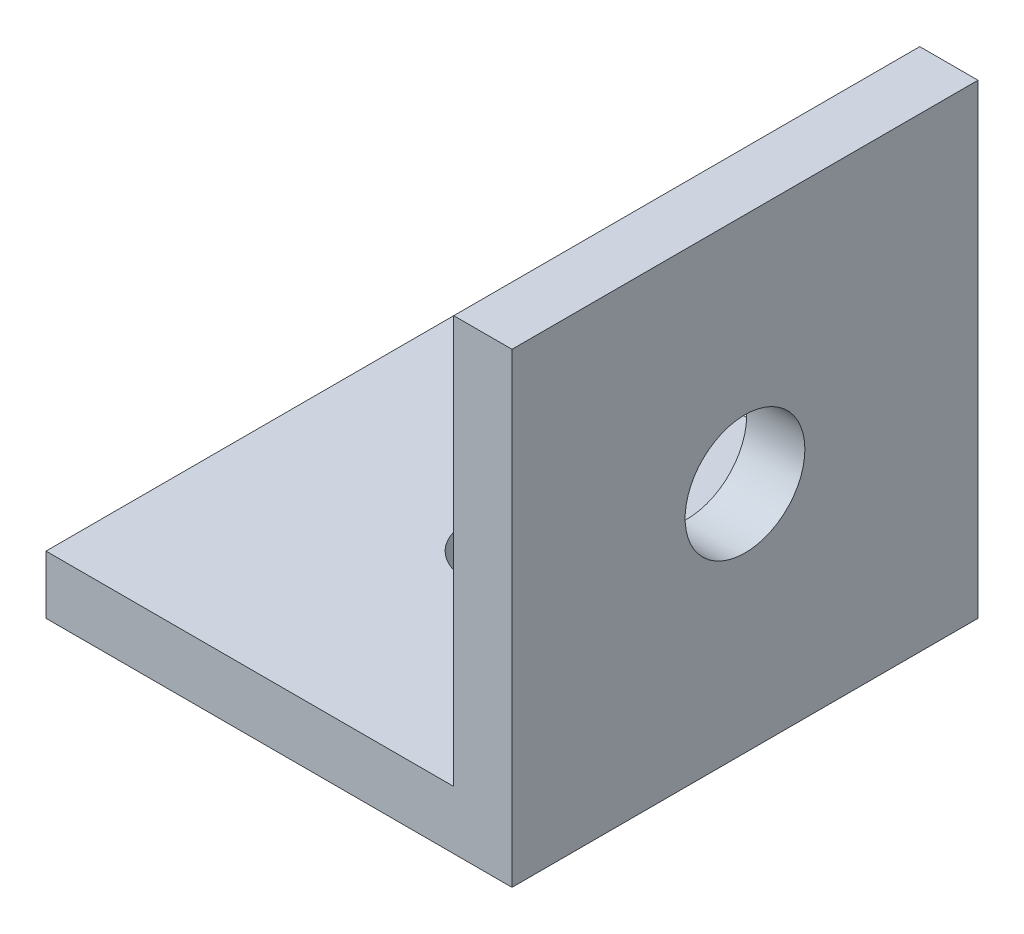
ISO-10303-21;
HEADER;
FILE_DESCRIPTION(('STEP AP214'),'2;1');
FILE_NAME('part.step','',(''),(''),'','','');
FILE_SCHEMA(('AUTOMOTIVE_DESIGN { 1 0 10303 214 1 1 1 1 }'));
ENDSEC;
DATA;
#1=APPLICATION_CONTEXT('core data for automotive mechanical design processes');
#2=APPLICATION_PROTOCOL_DEFINITION('international standard','automotive_design',2000,#1);
#3=PRODUCT_CONTEXT('',#1,'mechanical');
#4=PRODUCT('Part','Part','',(#3));
#5=PRODUCT_RELATED_PRODUCT_CATEGORY('part','',(#4));
#6=PRODUCT_DEFINITION_FORMATION('','',#4);
#7=PRODUCT_DEFINITION_CONTEXT('part definition',#1,'design');
#8=PRODUCT_DEFINITION('design','',#6,#7);
#9=PRODUCT_DEFINITION_SHAPE('','',#8);
#10=(LENGTH_UNIT() NAMED_UNIT(*) SI_UNIT(.MILLI.,.METRE.));
#11=(NAMED_UNIT(*) PLANE_ANGLE_UNIT() SI_UNIT($,.RADIAN.));
#12=(NAMED_UNIT(*) SI_UNIT($,.STERADIAN.) SOLID_ANGLE_UNIT());
#13=UNCERTAINTY_MEASURE_WITH_UNIT(LENGTH_MEASURE(1.E-05),#10,'distance_accuracy_value','');
#14=(GEOMETRIC_REPRESENTATION_CONTEXT(3) GLOBAL_UNCERTAINTY_ASSIGNED_CONTEXT((#13)) GLOBAL_UNIT_ASSIGNED_CONTEXT((#10,
#11,#12)) REPRESENTATION_CONTEXT('',''));
#15=CARTESIAN_POINT('',(0.,0.,0.));
#16=DIRECTION('',(0.,0.,1.));
#17=DIRECTION('',(1.,0.,0.));
#18=AXIS2_PLACEMENT_3D('',#15,#16,#17);
#19=CARTESIAN_POINT('',(0.,3.175,25.4));
#20=DIRECTION('',(1.,0.,0.));
#21=DIRECTION('',(0.,0.,-1.));
#22=AXIS2_PLACEMENT_3D('',#19,#20,#21);
#23=PLANE('',#22);
#24=DIRECTION('',(0.,-1.,0.));
#25=VECTOR('',#24,1.);
#26=CARTESIAN_POINT('',(0.,3.175,0.));
#27=LINE('',#26,#25);
#28=CARTESIAN_POINT('',(0.,3.175,0.));
#29=VERTEX_POINT('',#28);
#30=CARTESIAN_POINT('',(0.,0.,0.));
#31=VERTEX_POINT('',#30);
#32=EDGE_CURVE('E117',#29,#31,#27,.T.);
#33=ORIENTED_EDGE('',*,*,#32,.T.);
#34=DIRECTION('',(0.,0.,-1.));
#35=VECTOR('',#34,1.);
#36=CARTESIAN_POINT('',(0.,0.,25.4));
#37=LINE('',#36,#35);
#38=CARTESIAN_POINT('',(0.,0.,25.4));
#39=VERTEX_POINT('',#38);
#40=EDGE_CURVE('E11',#39,#31,#37,.T.);
#41=ORIENTED_EDGE('',*,*,#40,.F.);
#42=DIRECTION('',(0.,-1.,0.));
#43=VECTOR('',#42,1.);
#44=CARTESIAN_POINT('',(0.,3.175,25.4));
#45=LINE('',#44,#43);
#46=CARTESIAN_POINT('',(0.,3.175,25.4));
#47=VERTEX_POINT('',#46);
#48=EDGE_CURVE('E128',#47,#39,#45,.T.);
#49=ORIENTED_EDGE('',*,*,#48,.F.);
#50=DIRECTION('',(0.,0.,-1.));
#51=VECTOR('',#50,1.);
#52=CARTESIAN_POINT('',(0.,3.175,25.4));
#53=LINE('',#52,#51);
#54=EDGE_CURVE('E113',#47,#29,#53,.T.);
#55=ORIENTED_EDGE('',*,*,#54,.T.);
#56=EDGE_LOOP('',(#33,#41,#49,#55));
#57=FACE_BOUND('',#56,.T.);
#58=ADVANCED_FACE('F33',(#57),#23,.F.);
#59=CARTESIAN_POINT('',(0.,0.,25.4));
#60=DIRECTION('',(0.,1.,0.));
#61=DIRECTION('',(0.,0.,1.));
#62=AXIS2_PLACEMENT_3D('',#59,#60,#61);
#63=PLANE('',#62);
#64=CARTESIAN_POINT('',(12.7,0.,12.7));
#65=DIRECTION('',(0.,-1.,0.));
#66=DIRECTION('',(0.,0.,-1.));
#67=AXIS2_PLACEMENT_3D('',#64,#65,#66);
#68=CIRCLE('',#67,2.57968749999999);
#69=CARTESIAN_POINT('',(12.7,0.,10.1203125));
#70=VERTEX_POINT('',#69);
#71=EDGE_CURVE('E233',#70,#70,#68,.T.);
#72=ORIENTED_EDGE('',*,*,#71,.F.);
#73=EDGE_LOOP('',(#72));
#74=FACE_BOUND('',#73,.T.);
#75=DIRECTION('',(1.,0.,0.));
#76=VECTOR('',#75,1.);
#77=CARTESIAN_POINT('',(0.,0.,0.));
#78=LINE('',#77,#76);
#79=CARTESIAN_POINT('',(25.4,0.,0.));
#80=VERTEX_POINT('',#79);
#81=EDGE_CURVE('E120',#31,#80,#78,.T.);
#82=ORIENTED_EDGE('',*,*,#81,.T.);
#83=DIRECTION('',(0.,0.,-1.));
#84=VECTOR('',#83,1.);
#85=CARTESIAN_POINT('',(25.4,0.,25.4));
#86=LINE('',#85,#84);
#87=CARTESIAN_POINT('',(25.4,0.,25.4));
#88=VERTEX_POINT('',#87);
#89=EDGE_CURVE('E41',#88,#80,#86,.T.);
#90=ORIENTED_EDGE('',*,*,#89,.F.);
#91=DIRECTION('',(1.,0.,0.));
#92=VECTOR('',#91,1.);
#93=CARTESIAN_POINT('',(0.,0.,25.4));
#94=LINE('',#93,#92);
#95=EDGE_CURVE('E86',#39,#88,#94,.T.);
#96=ORIENTED_EDGE('',*,*,#95,.F.);
#97=ORIENTED_EDGE('',*,*,#40,.T.);
#98=EDGE_LOOP('',(#82,#90,#96,#97));
#99=FACE_BOUND('',#98,.T.);
#100=ADVANCED_FACE('F156',(#74,#99),#63,.F.);
#101=CARTESIAN_POINT('',(25.4,0.,25.4));
#102=DIRECTION('',(-1.,0.,0.));
#103=DIRECTION('',(0.,0.,1.));
#104=AXIS2_PLACEMENT_3D('',#101,#102,#103);
#105=PLANE('',#104);
#106=CARTESIAN_POINT('',(25.4,12.7,12.7));
#107=DIRECTION('',(1.,0.,0.));
#108=DIRECTION('',(0.,0.,-1.));
#109=AXIS2_PLACEMENT_3D('',#106,#107,#108);
#110=CIRCLE('',#109,3.2639);
#111=CARTESIAN_POINT('',(25.4,12.7,9.4361));
#112=VERTEX_POINT('',#111);
#113=EDGE_CURVE('E243',#112,#112,#110,.T.);
#114=ORIENTED_EDGE('',*,*,#113,.F.);
#115=EDGE_LOOP('',(#114));
#116=FACE_BOUND('',#115,.T.);
#117=DIRECTION('',(0.,1.,0.));
#118=VECTOR('',#117,1.);
#119=CARTESIAN_POINT('',(25.4,0.,0.));
#120=LINE('',#119,#118);
#121=CARTESIAN_POINT('',(25.4,25.4,0.));
#122=VERTEX_POINT('',#121);
#123=EDGE_CURVE('E123',#80,#122,#120,.T.);
#124=ORIENTED_EDGE('',*,*,#123,.T.);
#125=DIRECTION('',(0.,0.,-1.));
#126=VECTOR('',#125,1.);
#127=CARTESIAN_POINT('',(25.4,25.4,25.4));
#128=LINE('',#127,#126);
#129=CARTESIAN_POINT('',(25.4,25.4,25.4));
#130=VERTEX_POINT('',#129);
#131=EDGE_CURVE('E108',#130,#122,#128,.T.);
#132=ORIENTED_EDGE('',*,*,#131,.F.);
#133=DIRECTION('',(0.,1.,0.));
#134=VECTOR('',#133,1.);
#135=CARTESIAN_POINT('',(25.4,0.,25.4));
#136=LINE('',#135,#134);
#137=EDGE_CURVE('E99',#88,#130,#136,.T.);
#138=ORIENTED_EDGE('',*,*,#137,.F.);
#139=ORIENTED_EDGE('',*,*,#89,.T.);
#140=EDGE_LOOP('',(#124,#132,#138,#139));
#141=FACE_BOUND('',#140,.T.);
#142=ADVANCED_FACE('F134',(#116,#141),#105,.F.);
#143=CARTESIAN_POINT('',(25.4,25.4,25.4));
#144=DIRECTION('',(0.,-1.,0.));
#145=DIRECTION('',(0.,0.,-1.));
#146=AXIS2_PLACEMENT_3D('',#143,#144,#145);
#147=PLANE('',#146);
#148=DIRECTION('',(-1.,0.,0.));
#149=VECTOR('',#148,1.);
#150=CARTESIAN_POINT('',(25.4,25.4,0.));
#151=LINE('',#150,#149);
#152=CARTESIAN_POINT('',(22.225,25.4,0.));
#153=VERTEX_POINT('',#152);
#154=EDGE_CURVE('E107',#122,#153,#151,.T.);
#155=ORIENTED_EDGE('',*,*,#154,.T.);
#156=DIRECTION('',(0.,0.,-1.));
#157=VECTOR('',#156,1.);
#158=CARTESIAN_POINT('',(22.225,25.4,25.4));
#159=LINE('',#158,#157);
#160=CARTESIAN_POINT('',(22.225,25.4,25.4));
#161=VERTEX_POINT('',#160);
#162=EDGE_CURVE('E104',#161,#153,#159,.T.);
#163=ORIENTED_EDGE('',*,*,#162,.F.);
#164=DIRECTION('',(-1.,0.,0.));
#165=VECTOR('',#164,1.);
#166=CARTESIAN_POINT('',(25.4,25.4,25.4));
#167=LINE('',#166,#165);
#168=EDGE_CURVE('E93',#130,#161,#167,.T.);
#169=ORIENTED_EDGE('',*,*,#168,.F.);
#170=ORIENTED_EDGE('',*,*,#131,.T.);
#171=EDGE_LOOP('',(#155,#163,#169,#170));
#172=FACE_BOUND('',#171,.T.);
#173=ADVANCED_FACE('F105',(#172),#147,.F.);
#174=CARTESIAN_POINT('',(22.225,3.175,25.4));
#175=DIRECTION('',(1.,0.,0.));
#176=DIRECTION('',(0.,0.,-1.));
#177=AXIS2_PLACEMENT_3D('',#174,#175,#176);
#178=PLANE('',#177);
#179=CARTESIAN_POINT('',(22.225,12.7,12.7));
#180=DIRECTION('',(1.,0.,0.));
#181=DIRECTION('',(0.,0.,-1.));
#182=AXIS2_PLACEMENT_3D('',#179,#180,#181);
#183=CIRCLE('',#182,3.2639);
#184=CARTESIAN_POINT('',(22.225,12.7,9.4361));
#185=VERTEX_POINT('',#184);
#186=EDGE_CURVE('E236',#185,#185,#183,.T.);
#187=ORIENTED_EDGE('',*,*,#186,.T.);
#188=EDGE_LOOP('',(#187));
#189=FACE_BOUND('',#188,.T.);
#190=DIRECTION('',(0.,-1.,0.));
#191=VECTOR('',#190,1.);
#192=CARTESIAN_POINT('',(22.225,3.175,0.));
#193=LINE('',#192,#191);
#194=CARTESIAN_POINT('',(22.225,3.175,0.));
#195=VERTEX_POINT('',#194);
#196=EDGE_CURVE('E72',#153,#195,#193,.T.);
#197=ORIENTED_EDGE('',*,*,#196,.T.);
#198=DIRECTION('',(0.,0.,-1.));
#199=VECTOR('',#198,1.);
#200=CARTESIAN_POINT('',(22.225,3.175,25.4));
#201=LINE('',#200,#199);
#202=CARTESIAN_POINT('',(22.225,3.175,25.4));
#203=VERTEX_POINT('',#202);
#204=EDGE_CURVE('E109',#203,#195,#201,.T.);
#205=ORIENTED_EDGE('',*,*,#204,.F.);
#206=DIRECTION('',(0.,-1.,0.));
#207=VECTOR('',#206,1.);
#208=CARTESIAN_POINT('',(22.225,3.175,25.4));
#209=LINE('',#208,#207);
#210=EDGE_CURVE('E97',#161,#203,#209,.T.);
#211=ORIENTED_EDGE('',*,*,#210,.F.);
#212=ORIENTED_EDGE('',*,*,#162,.T.);
#213=EDGE_LOOP('',(#197,#205,#211,#212));
#214=FACE_BOUND('',#213,.T.);
#215=ADVANCED_FACE('F111',(#189,#214),#178,.F.);
#216=CARTESIAN_POINT('',(0.,3.175,25.4));
#217=DIRECTION('',(0.,-1.,0.));
#218=DIRECTION('',(0.,0.,-1.));
#219=AXIS2_PLACEMENT_3D('',#216,#217,#218);
#220=PLANE('',#219);
#221=CARTESIAN_POINT('',(12.7,3.175,12.7));
#222=DIRECTION('',(0.,-1.,0.));
#223=DIRECTION('',(0.,0.,-1.));
#224=AXIS2_PLACEMENT_3D('',#221,#222,#223);
#225=CIRCLE('',#224,2.57968749999999);
#226=CARTESIAN_POINT('',(12.7,3.175,10.1203125));
#227=VERTEX_POINT('',#226);
#228=EDGE_CURVE('E121',#227,#227,#225,.T.);
#229=ORIENTED_EDGE('',*,*,#228,.T.);
#230=EDGE_LOOP('',(#229));
#231=FACE_BOUND('',#230,.T.);
#232=DIRECTION('',(-1.,0.,0.));
#233=VECTOR('',#232,1.);
#234=CARTESIAN_POINT('',(0.,3.175,0.));
#235=LINE('',#234,#233);
#236=EDGE_CURVE('E78',#195,#29,#235,.T.);
#237=ORIENTED_EDGE('',*,*,#236,.T.);
#238=ORIENTED_EDGE('',*,*,#54,.F.);
#239=DIRECTION('',(-1.,0.,0.));
#240=VECTOR('',#239,1.);
#241=CARTESIAN_POINT('',(0.,3.175,25.4));
#242=LINE('',#241,#240);
#243=EDGE_CURVE('E49',#203,#47,#242,.T.);
#244=ORIENTED_EDGE('',*,*,#243,.F.);
#245=ORIENTED_EDGE('',*,*,#204,.T.);
#246=EDGE_LOOP('',(#237,#238,#244,#245));
#247=FACE_BOUND('',#246,.T.);
#248=ADVANCED_FACE('F141',(#231,#247),#220,.F.);
#249=CARTESIAN_POINT('',(0.,0.,25.4));
#250=DIRECTION('',(0.,0.,1.));
#251=DIRECTION('',(1.,0.,0.));
#252=AXIS2_PLACEMENT_3D('',#249,#250,#251);
#253=PLANE('',#252);
#254=ORIENTED_EDGE('',*,*,#48,.T.);
#255=ORIENTED_EDGE('',*,*,#95,.T.);
#256=ORIENTED_EDGE('',*,*,#137,.T.);
#257=ORIENTED_EDGE('',*,*,#168,.T.);
#258=ORIENTED_EDGE('',*,*,#210,.T.);
#259=ORIENTED_EDGE('',*,*,#243,.T.);
#260=EDGE_LOOP('',(#254,#255,#256,#257,#258,#259));
#261=FACE_BOUND('',#260,.T.);
#262=ADVANCED_FACE('F95',(#261),#253,.T.);
#263=CARTESIAN_POINT('',(0.,0.,0.));
#264=DIRECTION('',(0.,0.,1.));
#265=DIRECTION('',(1.,0.,0.));
#266=AXIS2_PLACEMENT_3D('',#263,#264,#265);
#267=PLANE('',#266);
#268=ORIENTED_EDGE('',*,*,#32,.F.);
#269=ORIENTED_EDGE('',*,*,#236,.F.);
#270=ORIENTED_EDGE('',*,*,#196,.F.);
#271=ORIENTED_EDGE('',*,*,#154,.F.);
#272=ORIENTED_EDGE('',*,*,#123,.F.);
#273=ORIENTED_EDGE('',*,*,#81,.F.);
#274=EDGE_LOOP('',(#268,#269,#270,#271,#272,#273));
#275=FACE_BOUND('',#274,.T.);
#276=ADVANCED_FACE('F137',(#275),#267,.F.);
#277=CARTESIAN_POINT('',(12.7,0.,12.7));
#278=DIRECTION('',(0.,-1.,0.));
#279=DIRECTION('',(0.,0.,-1.));
#280=AXIS2_PLACEMENT_3D('',#277,#278,#279);
#281=CYLINDRICAL_SURFACE('',#280,2.57968749999999);
#282=ORIENTED_EDGE('',*,*,#71,.T.);
#283=EDGE_LOOP('',(#282));
#284=FACE_BOUND('',#283,.T.);
#285=ORIENTED_EDGE('',*,*,#228,.F.);
#286=EDGE_LOOP('',(#285));
#287=FACE_BOUND('',#286,.T.);
#288=ADVANCED_FACE('F190',(#284,#287),#281,.F.);
#289=CARTESIAN_POINT('',(25.4,12.7,12.7));
#290=DIRECTION('',(1.,0.,0.));
#291=DIRECTION('',(0.,0.,-1.));
#292=AXIS2_PLACEMENT_3D('',#289,#290,#291);
#293=CYLINDRICAL_SURFACE('',#292,3.2639);
#294=ORIENTED_EDGE('',*,*,#113,.T.);
#295=EDGE_LOOP('',(#294));
#296=FACE_BOUND('',#295,.T.);
#297=ORIENTED_EDGE('',*,*,#186,.F.);
#298=EDGE_LOOP('',(#297));
#299=FACE_BOUND('',#298,.T.);
#300=ADVANCED_FACE('F186',(#296,#299),#293,.F.);
#301=CLOSED_SHELL('',(#58,#100,#142,#173,#215,#248,#262,#276,#288,#300));
#302=MANIFOLD_SOLID_BREP('B2',#301);
#303=ADVANCED_BREP_SHAPE_REPRESENTATION('',(#18,#302),#14);
#304=SHAPE_DEFINITION_REPRESENTATION(#9,#303);
ENDSEC;
END-ISO-10303-21;
